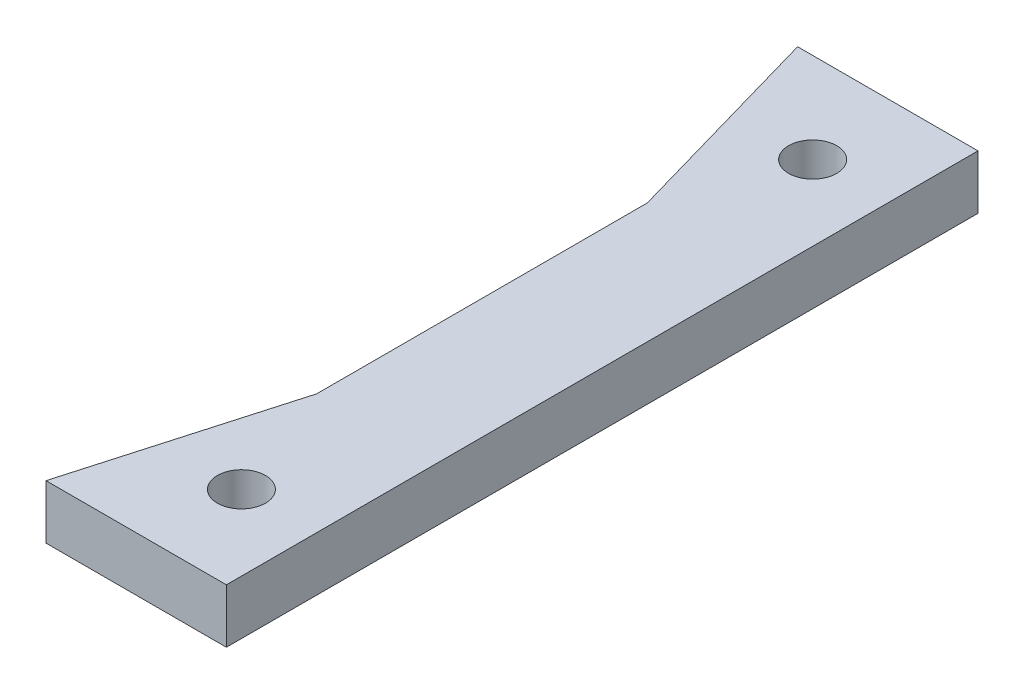
ISO-10303-21;
HEADER;
FILE_DESCRIPTION(('STEP AP214'),'2;1');
FILE_NAME('part.step','',(''),(''),'','','');
FILE_SCHEMA(('AUTOMOTIVE_DESIGN { 1 0 10303 214 1 1 1 1 }'));
ENDSEC;
DATA;
#1=APPLICATION_CONTEXT('core data for automotive mechanical design processes');
#2=APPLICATION_PROTOCOL_DEFINITION('international standard','automotive_design',2000,#1);
#3=PRODUCT_CONTEXT('',#1,'mechanical');
#4=PRODUCT('Part','Part','',(#3));
#5=PRODUCT_RELATED_PRODUCT_CATEGORY('part','',(#4));
#6=PRODUCT_DEFINITION_FORMATION('','',#4);
#7=PRODUCT_DEFINITION_CONTEXT('part definition',#1,'design');
#8=PRODUCT_DEFINITION('design','',#6,#7);
#9=PRODUCT_DEFINITION_SHAPE('','',#8);
#10=(LENGTH_UNIT() NAMED_UNIT(*) SI_UNIT(.MILLI.,.METRE.));
#11=(NAMED_UNIT(*) PLANE_ANGLE_UNIT() SI_UNIT($,.RADIAN.));
#12=(NAMED_UNIT(*) SI_UNIT($,.STERADIAN.) SOLID_ANGLE_UNIT());
#13=UNCERTAINTY_MEASURE_WITH_UNIT(LENGTH_MEASURE(1.E-05),#10,'distance_accuracy_value','');
#14=(GEOMETRIC_REPRESENTATION_CONTEXT(3) GLOBAL_UNCERTAINTY_ASSIGNED_CONTEXT((#13)) GLOBAL_UNIT_ASSIGNED_CONTEXT((#10,
#11,#12)) REPRESENTATION_CONTEXT('',''));
#15=CARTESIAN_POINT('',(0.,0.,0.));
#16=DIRECTION('',(0.,0.,1.));
#17=DIRECTION('',(1.,0.,0.));
#18=AXIS2_PLACEMENT_3D('',#15,#16,#17);
#19=CARTESIAN_POINT('',(0.,9.,0.));
#20=DIRECTION('',(1.,0.,0.));
#21=DIRECTION('',(0.,0.,-1.));
#22=AXIS2_PLACEMENT_3D('',#19,#20,#21);
#23=PLANE('',#22);
#24=DIRECTION('',(0.,0.,1.));
#25=VECTOR('',#24,1.);
#26=CARTESIAN_POINT('',(0.,0.,0.));
#27=LINE('',#26,#25);
#28=CARTESIAN_POINT('',(0.,0.,-62.5));
#29=VERTEX_POINT('',#28);
#30=CARTESIAN_POINT('',(0.,0.,62.5));
#31=VERTEX_POINT('',#30);
#32=EDGE_CURVE('E129',#29,#31,#27,.T.);
#33=ORIENTED_EDGE('',*,*,#32,.F.);
#34=DIRECTION('',(0.,-1.,0.));
#35=VECTOR('',#34,1.);
#36=CARTESIAN_POINT('',(0.,9.,-62.5));
#37=LINE('',#36,#35);
#38=CARTESIAN_POINT('',(0.,9.,-62.5));
#39=VERTEX_POINT('',#38);
#40=EDGE_CURVE('E11',#39,#29,#37,.T.);
#41=ORIENTED_EDGE('',*,*,#40,.F.);
#42=DIRECTION('',(0.,0.,1.));
#43=VECTOR('',#42,1.);
#44=CARTESIAN_POINT('',(0.,9.,0.));
#45=LINE('',#44,#43);
#46=CARTESIAN_POINT('',(0.,9.,62.5));
#47=VERTEX_POINT('',#46);
#48=EDGE_CURVE('E148',#39,#47,#45,.T.);
#49=ORIENTED_EDGE('',*,*,#48,.T.);
#50=DIRECTION('',(0.,-1.,0.));
#51=VECTOR('',#50,1.);
#52=CARTESIAN_POINT('',(0.,9.,62.5));
#53=LINE('',#52,#51);
#54=EDGE_CURVE('E84',#47,#31,#53,.T.);
#55=ORIENTED_EDGE('',*,*,#54,.T.);
#56=EDGE_LOOP('',(#33,#41,#49,#55));
#57=FACE_BOUND('',#56,.T.);
#58=ADVANCED_FACE('F40',(#57),#23,.T.);
#59=CARTESIAN_POINT('',(0.,9.,-62.5));
#60=DIRECTION('',(0.,0.,-1.));
#61=DIRECTION('',(-1.,0.,0.));
#62=AXIS2_PLACEMENT_3D('',#59,#60,#61);
#63=PLANE('',#62);
#64=DIRECTION('',(1.,0.,0.));
#65=VECTOR('',#64,1.);
#66=CARTESIAN_POINT('',(0.,0.,-62.5));
#67=LINE('',#66,#65);
#68=CARTESIAN_POINT('',(-30.,0.,-62.5));
#69=VERTEX_POINT('',#68);
#70=EDGE_CURVE('E132',#69,#29,#67,.T.);
#71=ORIENTED_EDGE('',*,*,#70,.F.);
#72=DIRECTION('',(0.,-1.,0.));
#73=VECTOR('',#72,1.);
#74=CARTESIAN_POINT('',(-30.,9.,-62.5));
#75=LINE('',#74,#73);
#76=CARTESIAN_POINT('',(-30.,9.,-62.5));
#77=VERTEX_POINT('',#76);
#78=EDGE_CURVE('E48',#77,#69,#75,.T.);
#79=ORIENTED_EDGE('',*,*,#78,.F.);
#80=DIRECTION('',(1.,0.,0.));
#81=VECTOR('',#80,1.);
#82=CARTESIAN_POINT('',(0.,9.,-62.5));
#83=LINE('',#82,#81);
#84=EDGE_CURVE('E118',#77,#39,#83,.T.);
#85=ORIENTED_EDGE('',*,*,#84,.T.);
#86=ORIENTED_EDGE('',*,*,#40,.T.);
#87=EDGE_LOOP('',(#71,#79,#85,#86));
#88=FACE_BOUND('',#87,.T.);
#89=ADVANCED_FACE('F157',(#88),#63,.T.);
#90=CARTESIAN_POINT('',(-11.2264150943397,9.,3.20754716981132));
#91=DIRECTION('',(-0.961523947640823,0.,0.274721127897377));
#92=DIRECTION('',(0.274721127897377,0.,0.961523947640823));
#93=AXIS2_PLACEMENT_3D('',#90,#91,#92);
#94=PLANE('',#93);
#95=DIRECTION('',(-0.274721127897377,0.,-0.961523947640823));
#96=VECTOR('',#95,1.);
#97=CARTESIAN_POINT('',(-11.2264150943397,0.,3.20754716981132));
#98=LINE('',#97,#96);
#99=CARTESIAN_POINT('',(-20.,0.,-27.5));
#100=VERTEX_POINT('',#99);
#101=EDGE_CURVE('E135',#100,#69,#98,.T.);
#102=ORIENTED_EDGE('',*,*,#101,.F.);
#103=DIRECTION('',(0.,-1.,0.));
#104=VECTOR('',#103,1.);
#105=CARTESIAN_POINT('',(-20.,9.,-27.5));
#106=LINE('',#105,#104);
#107=CARTESIAN_POINT('',(-20.,9.,-27.5));
#108=VERTEX_POINT('',#107);
#109=EDGE_CURVE('E105',#108,#100,#106,.T.);
#110=ORIENTED_EDGE('',*,*,#109,.F.);
#111=DIRECTION('',(-0.274721127897377,0.,-0.961523947640823));
#112=VECTOR('',#111,1.);
#113=CARTESIAN_POINT('',(-11.2264150943397,9.,3.20754716981132));
#114=LINE('',#113,#112);
#115=EDGE_CURVE('E116',#108,#77,#114,.T.);
#116=ORIENTED_EDGE('',*,*,#115,.T.);
#117=ORIENTED_EDGE('',*,*,#78,.T.);
#118=EDGE_LOOP('',(#102,#110,#116,#117));
#119=FACE_BOUND('',#118,.T.);
#120=ADVANCED_FACE('F154',(#119),#94,.T.);
#121=CARTESIAN_POINT('',(-20.,9.,0.));
#122=DIRECTION('',(-1.,0.,0.));
#123=DIRECTION('',(0.,0.,1.));
#124=AXIS2_PLACEMENT_3D('',#121,#122,#123);
#125=PLANE('',#124);
#126=DIRECTION('',(0.,0.,-1.));
#127=VECTOR('',#126,1.);
#128=CARTESIAN_POINT('',(-20.,0.,0.));
#129=LINE('',#128,#127);
#130=CARTESIAN_POINT('',(-20.,0.,27.5));
#131=VERTEX_POINT('',#130);
#132=EDGE_CURVE('E104',#131,#100,#129,.T.);
#133=ORIENTED_EDGE('',*,*,#132,.F.);
#134=DIRECTION('',(0.,-1.,0.));
#135=VECTOR('',#134,1.);
#136=CARTESIAN_POINT('',(-20.,9.,27.5));
#137=LINE('',#136,#135);
#138=CARTESIAN_POINT('',(-20.,9.,27.5));
#139=VERTEX_POINT('',#138);
#140=EDGE_CURVE('E98',#139,#131,#137,.T.);
#141=ORIENTED_EDGE('',*,*,#140,.F.);
#142=DIRECTION('',(0.,0.,-1.));
#143=VECTOR('',#142,1.);
#144=CARTESIAN_POINT('',(-20.,9.,0.));
#145=LINE('',#144,#143);
#146=EDGE_CURVE('E102',#139,#108,#145,.T.);
#147=ORIENTED_EDGE('',*,*,#146,.T.);
#148=ORIENTED_EDGE('',*,*,#109,.T.);
#149=EDGE_LOOP('',(#133,#141,#147,#148));
#150=FACE_BOUND('',#149,.T.);
#151=ADVANCED_FACE('F100',(#150),#125,.T.);
#152=CARTESIAN_POINT('',(-11.2264150943397,9.,-3.20754716981132));
#153=DIRECTION('',(0.961523947640823,0.,0.274721127897377));
#154=DIRECTION('',(0.274721127897377,0.,-0.961523947640823));
#155=AXIS2_PLACEMENT_3D('',#152,#153,#154);
#156=PLANE('',#155);
#157=DIRECTION('',(-0.274721127897377,0.,0.961523947640823));
#158=VECTOR('',#157,1.);
#159=CARTESIAN_POINT('',(-11.2264150943397,0.,-3.20754716981132));
#160=LINE('',#159,#158);
#161=CARTESIAN_POINT('',(-30.,0.,62.5));
#162=VERTEX_POINT('',#161);
#163=EDGE_CURVE('E77',#131,#162,#160,.T.);
#164=ORIENTED_EDGE('',*,*,#163,.T.);
#165=DIRECTION('',(0.,-1.,0.));
#166=VECTOR('',#165,1.);
#167=CARTESIAN_POINT('',(-30.,9.,62.5));
#168=LINE('',#167,#166);
#169=CARTESIAN_POINT('',(-30.,9.,62.5));
#170=VERTEX_POINT('',#169);
#171=EDGE_CURVE('E106',#170,#162,#168,.T.);
#172=ORIENTED_EDGE('',*,*,#171,.F.);
#173=DIRECTION('',(-0.274721127897377,0.,0.961523947640823));
#174=VECTOR('',#173,1.);
#175=CARTESIAN_POINT('',(-11.2264150943397,9.,-3.20754716981132));
#176=LINE('',#175,#174);
#177=EDGE_CURVE('E108',#139,#170,#176,.T.);
#178=ORIENTED_EDGE('',*,*,#177,.F.);
#179=ORIENTED_EDGE('',*,*,#140,.T.);
#180=EDGE_LOOP('',(#164,#172,#178,#179));
#181=FACE_BOUND('',#180,.T.);
#182=ADVANCED_FACE('F109',(#181),#156,.F.);
#183=CARTESIAN_POINT('',(-12.5,9.,-47.5));
#184=DIRECTION('',(0.,-1.,0.));
#185=DIRECTION('',(0.,0.,-1.));
#186=AXIS2_PLACEMENT_3D('',#183,#184,#185);
#187=CYLINDRICAL_SURFACE('',#186,4.00000000000001);
#188=CARTESIAN_POINT('',(-12.5,9.,-47.5));
#189=DIRECTION('',(0.,1.,0.));
#190=DIRECTION('',(0.,0.,1.));
#191=AXIS2_PLACEMENT_3D('',#188,#189,#190);
#192=CIRCLE('',#191,4.00000000000001);
#193=CARTESIAN_POINT('',(-12.5,9.,-43.5));
#194=VERTEX_POINT('',#193);
#195=EDGE_CURVE('E123',#194,#194,#192,.T.);
#196=ORIENTED_EDGE('',*,*,#195,.T.);
#197=EDGE_LOOP('',(#196));
#198=FACE_BOUND('',#197,.T.);
#199=CARTESIAN_POINT('',(-12.5,0.,-47.5));
#200=DIRECTION('',(0.,1.,0.));
#201=DIRECTION('',(0.,0.,1.));
#202=AXIS2_PLACEMENT_3D('',#199,#200,#201);
#203=CIRCLE('',#202,4.00000000000001);
#204=CARTESIAN_POINT('',(-12.5,0.,-43.5));
#205=VERTEX_POINT('',#204);
#206=EDGE_CURVE('E142',#205,#205,#203,.T.);
#207=ORIENTED_EDGE('',*,*,#206,.F.);
#208=EDGE_LOOP('',(#207));
#209=FACE_BOUND('',#208,.T.);
#210=ADVANCED_FACE('F178',(#198,#209),#187,.F.);
#211=CARTESIAN_POINT('',(0.,9.,62.5));
#212=DIRECTION('',(0.,0.,-1.));
#213=DIRECTION('',(-1.,0.,0.));
#214=AXIS2_PLACEMENT_3D('',#211,#212,#213);
#215=PLANE('',#214);
#216=DIRECTION('',(1.,0.,0.));
#217=VECTOR('',#216,1.);
#218=CARTESIAN_POINT('',(0.,0.,62.5));
#219=LINE('',#218,#217);
#220=EDGE_CURVE('E140',#162,#31,#219,.T.);
#221=ORIENTED_EDGE('',*,*,#220,.T.);
#222=ORIENTED_EDGE('',*,*,#54,.F.);
#223=DIRECTION('',(1.,0.,0.));
#224=VECTOR('',#223,1.);
#225=CARTESIAN_POINT('',(0.,9.,62.5));
#226=LINE('',#225,#224);
#227=EDGE_CURVE('E56',#170,#47,#226,.T.);
#228=ORIENTED_EDGE('',*,*,#227,.F.);
#229=ORIENTED_EDGE('',*,*,#171,.T.);
#230=EDGE_LOOP('',(#221,#222,#228,#229));
#231=FACE_BOUND('',#230,.T.);
#232=ADVANCED_FACE('F163',(#231),#215,.F.);
#233=CARTESIAN_POINT('',(-12.5,9.,47.5));
#234=DIRECTION('',(0.,-1.,0.));
#235=DIRECTION('',(0.,0.,-1.));
#236=AXIS2_PLACEMENT_3D('',#233,#234,#235);
#237=CYLINDRICAL_SURFACE('',#236,4.00000000000001);
#238=CARTESIAN_POINT('',(-12.5,9.,47.5));
#239=DIRECTION('',(0.,1.,0.));
#240=DIRECTION('',(0.,0.,1.));
#241=AXIS2_PLACEMENT_3D('',#238,#239,#240);
#242=CIRCLE('',#241,4.00000000000001);
#243=CARTESIAN_POINT('',(-12.5,9.,51.5));
#244=VERTEX_POINT('',#243);
#245=EDGE_CURVE('E126',#244,#244,#242,.F.);
#246=ORIENTED_EDGE('',*,*,#245,.F.);
#247=EDGE_LOOP('',(#246));
#248=FACE_BOUND('',#247,.T.);
#249=CARTESIAN_POINT('',(-12.5,0.,47.5));
#250=DIRECTION('',(0.,1.,0.));
#251=DIRECTION('',(0.,0.,1.));
#252=AXIS2_PLACEMENT_3D('',#249,#250,#251);
#253=CIRCLE('',#252,4.00000000000001);
#254=CARTESIAN_POINT('',(-12.5,0.,51.5));
#255=VERTEX_POINT('',#254);
#256=EDGE_CURVE('E145',#255,#255,#253,.F.);
#257=ORIENTED_EDGE('',*,*,#256,.T.);
#258=EDGE_LOOP('',(#257));
#259=FACE_BOUND('',#258,.T.);
#260=ADVANCED_FACE('F181',(#248,#259),#237,.F.);
#261=CARTESIAN_POINT('',(0.,9.,0.));
#262=DIRECTION('',(0.,1.,0.));
#263=DIRECTION('',(0.,0.,1.));
#264=AXIS2_PLACEMENT_3D('',#261,#262,#263);
#265=PLANE('',#264);
#266=ORIENTED_EDGE('',*,*,#48,.F.);
#267=ORIENTED_EDGE('',*,*,#84,.F.);
#268=ORIENTED_EDGE('',*,*,#115,.F.);
#269=ORIENTED_EDGE('',*,*,#146,.F.);
#270=ORIENTED_EDGE('',*,*,#177,.T.);
#271=ORIENTED_EDGE('',*,*,#227,.T.);
#272=EDGE_LOOP('',(#266,#267,#268,#269,#270,#271));
#273=FACE_BOUND('',#272,.T.);
#274=ORIENTED_EDGE('',*,*,#195,.F.);
#275=EDGE_LOOP('',(#274));
#276=FACE_BOUND('',#275,.T.);
#277=ORIENTED_EDGE('',*,*,#245,.T.);
#278=EDGE_LOOP('',(#277));
#279=FACE_BOUND('',#278,.T.);
#280=ADVANCED_FACE('F112',(#273,#276,#279),#265,.T.);
#281=CARTESIAN_POINT('',(0.,0.,0.));
#282=DIRECTION('',(0.,1.,0.));
#283=DIRECTION('',(0.,0.,1.));
#284=AXIS2_PLACEMENT_3D('',#281,#282,#283);
#285=PLANE('',#284);
#286=ORIENTED_EDGE('',*,*,#32,.T.);
#287=ORIENTED_EDGE('',*,*,#220,.F.);
#288=ORIENTED_EDGE('',*,*,#163,.F.);
#289=ORIENTED_EDGE('',*,*,#132,.T.);
#290=ORIENTED_EDGE('',*,*,#101,.T.);
#291=ORIENTED_EDGE('',*,*,#70,.T.);
#292=EDGE_LOOP('',(#286,#287,#288,#289,#290,#291));
#293=FACE_BOUND('',#292,.T.);
#294=ORIENTED_EDGE('',*,*,#206,.T.);
#295=EDGE_LOOP('',(#294));
#296=FACE_BOUND('',#295,.T.);
#297=ORIENTED_EDGE('',*,*,#256,.F.);
#298=EDGE_LOOP('',(#297));
#299=FACE_BOUND('',#298,.T.);
#300=ADVANCED_FACE('F159',(#293,#296,#299),#285,.F.);
#301=CLOSED_SHELL('',(#58,#89,#120,#151,#182,#210,#232,#260,#280,#300));
#302=MANIFOLD_SOLID_BREP('B2',#301);
#303=ADVANCED_BREP_SHAPE_REPRESENTATION('',(#18,#302),#14);
#304=SHAPE_DEFINITION_REPRESENTATION(#9,#303);
ENDSEC;
END-ISO-10303-21;
